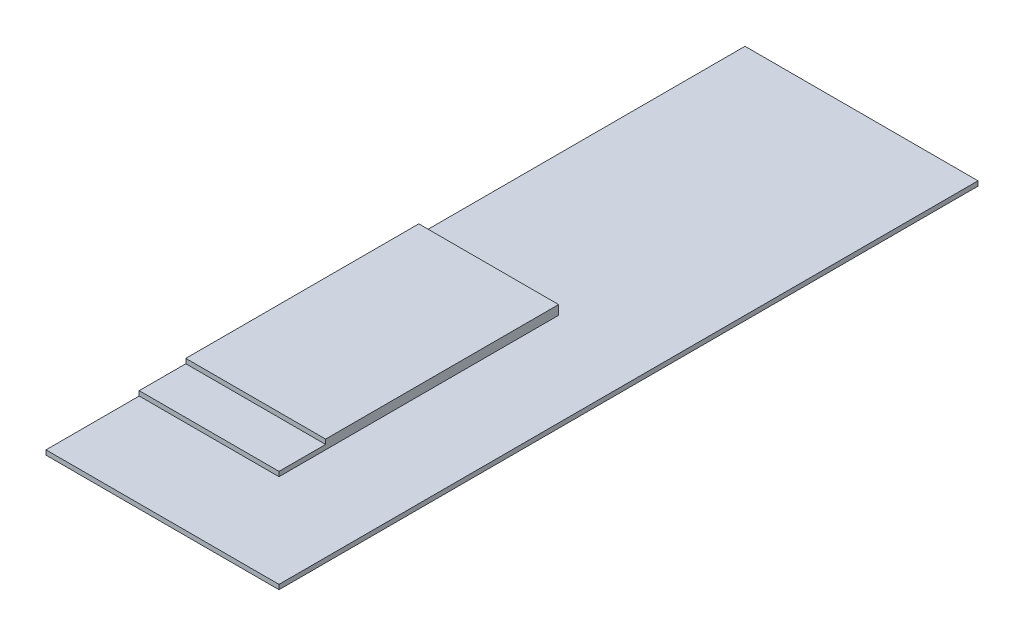
ISO-10303-21;
HEADER;
FILE_DESCRIPTION(('STEP AP214'),'2;1');
FILE_NAME('part.step','',(''),(''),'','','');
FILE_SCHEMA(('AUTOMOTIVE_DESIGN { 1 0 10303 214 1 1 1 1 }'));
ENDSEC;
DATA;
#1=APPLICATION_CONTEXT('core data for automotive mechanical design processes');
#2=APPLICATION_PROTOCOL_DEFINITION('international standard','automotive_design',2000,#1);
#3=PRODUCT_CONTEXT('',#1,'mechanical');
#4=PRODUCT('Part','Part','',(#3));
#5=PRODUCT_RELATED_PRODUCT_CATEGORY('part','',(#4));
#6=PRODUCT_DEFINITION_FORMATION('','',#4);
#7=PRODUCT_DEFINITION_CONTEXT('part definition',#1,'design');
#8=PRODUCT_DEFINITION('design','',#6,#7);
#9=PRODUCT_DEFINITION_SHAPE('','',#8);
#10=(LENGTH_UNIT() NAMED_UNIT(*) SI_UNIT(.MILLI.,.METRE.));
#11=(NAMED_UNIT(*) PLANE_ANGLE_UNIT() SI_UNIT($,.RADIAN.));
#12=(NAMED_UNIT(*) SI_UNIT($,.STERADIAN.) SOLID_ANGLE_UNIT());
#13=UNCERTAINTY_MEASURE_WITH_UNIT(LENGTH_MEASURE(1.E-05),#10,'distance_accuracy_value','');
#14=(GEOMETRIC_REPRESENTATION_CONTEXT(3) GLOBAL_UNCERTAINTY_ASSIGNED_CONTEXT((#13)) GLOBAL_UNIT_ASSIGNED_CONTEXT((#10,
#11,#12)) REPRESENTATION_CONTEXT('',''));
#15=CARTESIAN_POINT('',(0.,0.,0.));
#16=DIRECTION('',(0.,0.,1.));
#17=DIRECTION('',(1.,0.,0.));
#18=AXIS2_PLACEMENT_3D('',#15,#16,#17);
#19=CARTESIAN_POINT('',(436.363636363636,100.,-2218.18181818182));
#20=DIRECTION('',(-1.,0.,0.));
#21=DIRECTION('',(0.,0.,1.));
#22=AXIS2_PLACEMENT_3D('',#19,#20,#21);
#23=PLANE('',#22);
#24=DIRECTION('',(0.,0.,1.));
#25=VECTOR('',#24,1.);
#26=CARTESIAN_POINT('',(436.363636363636,100.,-2218.18181818182));
#27=LINE('',#26,#25);
#28=CARTESIAN_POINT('',(436.363636363636,100.,-2218.18181818182));
#29=VERTEX_POINT('',#28);
#30=CARTESIAN_POINT('',(436.363636363637,100.,3781.81818181818));
#31=VERTEX_POINT('',#30);
#32=EDGE_CURVE('E147',#29,#31,#27,.T.);
#33=ORIENTED_EDGE('',*,*,#32,.F.);
#34=DIRECTION('',(0.,-1.,0.));
#35=VECTOR('',#34,1.);
#36=CARTESIAN_POINT('',(436.363636363636,100.,-2218.18181818182));
#37=LINE('',#36,#35);
#38=CARTESIAN_POINT('',(436.363636363637,300.,-2218.18181818182));
#39=VERTEX_POINT('',#38);
#40=EDGE_CURVE('E41',#39,#29,#37,.T.);
#41=ORIENTED_EDGE('',*,*,#40,.F.);
#42=DIRECTION('',(0.,0.,-1.));
#43=VECTOR('',#42,1.);
#44=CARTESIAN_POINT('',(436.363636363637,300.,-2218.18181818182));
#45=LINE('',#44,#43);
#46=CARTESIAN_POINT('',(436.363636363637,300.,2781.81818181818));
#47=VERTEX_POINT('',#46);
#48=EDGE_CURVE('E156',#47,#39,#45,.T.);
#49=ORIENTED_EDGE('',*,*,#48,.F.);
#50=DIRECTION('',(0.,-1.,0.));
#51=VECTOR('',#50,1.);
#52=CARTESIAN_POINT('',(436.363636363637,300.,2781.81818181818));
#53=LINE('',#52,#51);
#54=CARTESIAN_POINT('',(436.363636363637,200.,2781.81818181818));
#55=VERTEX_POINT('',#54);
#56=EDGE_CURVE('E162',#47,#55,#53,.T.);
#57=ORIENTED_EDGE('',*,*,#56,.T.);
#58=DIRECTION('',(0.,0.,-1.));
#59=VECTOR('',#58,1.);
#60=CARTESIAN_POINT('',(436.363636363637,200.,3781.81818181818));
#61=LINE('',#60,#59);
#62=CARTESIAN_POINT('',(436.363636363637,200.,3781.81818181818));
#63=VERTEX_POINT('',#62);
#64=EDGE_CURVE('E174',#63,#55,#61,.T.);
#65=ORIENTED_EDGE('',*,*,#64,.F.);
#66=DIRECTION('',(0.,-1.,0.));
#67=VECTOR('',#66,1.);
#68=CARTESIAN_POINT('',(436.363636363637,200.,3781.81818181818));
#69=LINE('',#68,#67);
#70=EDGE_CURVE('E176',#63,#31,#69,.T.);
#71=ORIENTED_EDGE('',*,*,#70,.T.);
#72=EDGE_LOOP('',(#33,#41,#49,#57,#65,#71));
#73=FACE_BOUND('',#72,.T.);
#74=ADVANCED_FACE('F33',(#73),#23,.F.);
#75=CARTESIAN_POINT('',(-2563.63636363636,100.,-2218.18181818182));
#76=DIRECTION('',(0.,0.,1.));
#77=DIRECTION('',(1.,0.,0.));
#78=AXIS2_PLACEMENT_3D('',#75,#76,#77);
#79=PLANE('',#78);
#80=DIRECTION('',(1.,0.,0.));
#81=VECTOR('',#80,1.);
#82=CARTESIAN_POINT('',(-2563.63636363636,100.,-2218.18181818182));
#83=LINE('',#82,#81);
#84=CARTESIAN_POINT('',(-2563.63636363636,100.,-2218.18181818182));
#85=VERTEX_POINT('',#84);
#86=EDGE_CURVE('E48',#85,#29,#83,.T.);
#87=ORIENTED_EDGE('',*,*,#86,.F.);
#88=DIRECTION('',(0.,-1.,0.));
#89=VECTOR('',#88,1.);
#90=CARTESIAN_POINT('',(-2563.63636363636,100.,-2218.18181818182));
#91=LINE('',#90,#89);
#92=CARTESIAN_POINT('',(-2563.63636363636,300.,-2218.18181818182));
#93=VERTEX_POINT('',#92);
#94=EDGE_CURVE('E186',#93,#85,#91,.T.);
#95=ORIENTED_EDGE('',*,*,#94,.F.);
#96=DIRECTION('',(-1.,0.,0.));
#97=VECTOR('',#96,1.);
#98=CARTESIAN_POINT('',(-2563.63636363636,300.,-2218.18181818182));
#99=LINE('',#98,#97);
#100=EDGE_CURVE('E159',#39,#93,#99,.T.);
#101=ORIENTED_EDGE('',*,*,#100,.F.);
#102=ORIENTED_EDGE('',*,*,#40,.T.);
#103=EDGE_LOOP('',(#87,#95,#101,#102));
#104=FACE_BOUND('',#103,.T.);
#105=ADVANCED_FACE('F190',(#104),#79,.F.);
#106=CARTESIAN_POINT('',(0.,200.,0.));
#107=DIRECTION('',(0.,-1.,0.));
#108=DIRECTION('',(0.,0.,-1.));
#109=AXIS2_PLACEMENT_3D('',#106,#107,#108);
#110=PLANE('',#109);
#111=DIRECTION('',(1.,0.,0.));
#112=VECTOR('',#111,1.);
#113=CARTESIAN_POINT('',(-2563.63636363636,200.,2781.81818181818));
#114=LINE('',#113,#112);
#115=CARTESIAN_POINT('',(-2563.63636363636,200.,2781.81818181818));
#116=VERTEX_POINT('',#115);
#117=EDGE_CURVE('E56',#116,#55,#114,.T.);
#118=ORIENTED_EDGE('',*,*,#117,.F.);
#119=DIRECTION('',(0.,0.,1.));
#120=VECTOR('',#119,1.);
#121=CARTESIAN_POINT('',(-2563.63636363636,200.,3781.81818181818));
#122=LINE('',#121,#120);
#123=CARTESIAN_POINT('',(-2563.63636363636,200.,3781.81818181818));
#124=VERTEX_POINT('',#123);
#125=EDGE_CURVE('E170',#116,#124,#122,.T.);
#126=ORIENTED_EDGE('',*,*,#125,.T.);
#127=DIRECTION('',(1.,0.,0.));
#128=VECTOR('',#127,1.);
#129=CARTESIAN_POINT('',(-2563.63636363636,200.,3781.81818181818));
#130=LINE('',#129,#128);
#131=EDGE_CURVE('E172',#124,#63,#130,.T.);
#132=ORIENTED_EDGE('',*,*,#131,.T.);
#133=ORIENTED_EDGE('',*,*,#64,.T.);
#134=EDGE_LOOP('',(#118,#126,#132,#133));
#135=FACE_BOUND('',#134,.T.);
#136=ADVANCED_FACE('F211',(#135),#110,.F.);
#137=CARTESIAN_POINT('',(-2563.63636363636,100.,-2218.18181818182));
#138=DIRECTION('',(1.,0.,0.));
#139=DIRECTION('',(0.,0.,-1.));
#140=AXIS2_PLACEMENT_3D('',#137,#138,#139);
#141=PLANE('',#140);
#142=DIRECTION('',(0.,0.,1.));
#143=VECTOR('',#142,1.);
#144=CARTESIAN_POINT('',(-2563.63636363636,100.,-2218.18181818182));
#145=LINE('',#144,#143);
#146=CARTESIAN_POINT('',(-2563.63636363636,100.,3781.81818181818));
#147=VERTEX_POINT('',#146);
#148=CARTESIAN_POINT('',(-2563.63636363636,100.,5781.81818181818));
#149=VERTEX_POINT('',#148);
#150=EDGE_CURVE('E119',#147,#149,#145,.T.);
#151=ORIENTED_EDGE('',*,*,#150,.F.);
#152=DIRECTION('',(0.,-1.,0.));
#153=VECTOR('',#152,1.);
#154=CARTESIAN_POINT('',(-2563.63636363636,200.,3781.81818181818));
#155=LINE('',#154,#153);
#156=EDGE_CURVE('E180',#124,#147,#155,.T.);
#157=ORIENTED_EDGE('',*,*,#156,.F.);
#158=ORIENTED_EDGE('',*,*,#125,.F.);
#159=DIRECTION('',(0.,-1.,0.));
#160=VECTOR('',#159,1.);
#161=CARTESIAN_POINT('',(-2563.63636363636,300.,2781.81818181818));
#162=LINE('',#161,#160);
#163=CARTESIAN_POINT('',(-2563.63636363636,300.,2781.81818181818));
#164=VERTEX_POINT('',#163);
#165=EDGE_CURVE('E166',#164,#116,#162,.T.);
#166=ORIENTED_EDGE('',*,*,#165,.F.);
#167=DIRECTION('',(0.,0.,1.));
#168=VECTOR('',#167,1.);
#169=CARTESIAN_POINT('',(-2563.63636363636,300.,-2218.18181818182));
#170=LINE('',#169,#168);
#171=EDGE_CURVE('E151',#93,#164,#170,.T.);
#172=ORIENTED_EDGE('',*,*,#171,.F.);
#173=ORIENTED_EDGE('',*,*,#94,.T.);
#174=DIRECTION('',(0.,0.,1.));
#175=VECTOR('',#174,1.);
#176=CARTESIAN_POINT('',(-2563.63636363636,100.,5781.81818181818));
#177=LINE('',#176,#175);
#178=CARTESIAN_POINT('',(-2563.63636363636,100.,-9218.18181818182));
#179=VERTEX_POINT('',#178);
#180=EDGE_CURVE('E140',#179,#85,#177,.T.);
#181=ORIENTED_EDGE('',*,*,#180,.F.);
#182=DIRECTION('',(0.,1.,0.));
#183=VECTOR('',#182,1.);
#184=CARTESIAN_POINT('',(-2563.63636363636,0.,-9218.18181818182));
#185=LINE('',#184,#183);
#186=CARTESIAN_POINT('',(-2563.63636363636,0.,-9218.18181818182));
#187=VERTEX_POINT('',#186);
#188=EDGE_CURVE('E144',#187,#179,#185,.T.);
#189=ORIENTED_EDGE('',*,*,#188,.F.);
#190=DIRECTION('',(0.,0.,1.));
#191=VECTOR('',#190,1.);
#192=CARTESIAN_POINT('',(-2563.63636363636,0.,-2218.18181818182));
#193=LINE('',#192,#191);
#194=CARTESIAN_POINT('',(-2563.63636363636,0.,5781.81818181818));
#195=VERTEX_POINT('',#194);
#196=EDGE_CURVE('E120',#187,#195,#193,.T.);
#197=ORIENTED_EDGE('',*,*,#196,.T.);
#198=DIRECTION('',(0.,-1.,0.));
#199=VECTOR('',#198,1.);
#200=CARTESIAN_POINT('',(-2563.63636363636,100.,5781.81818181818));
#201=LINE('',#200,#199);
#202=EDGE_CURVE('E11',#149,#195,#201,.T.);
#203=ORIENTED_EDGE('',*,*,#202,.F.);
#204=EDGE_LOOP('',(#151,#157,#158,#166,#172,#173,#181,#189,#197,#203));
#205=FACE_BOUND('',#204,.T.);
#206=ADVANCED_FACE('F35',(#205),#141,.F.);
#207=CARTESIAN_POINT('',(-2563.63636363636,100.,5781.81818181818));
#208=DIRECTION('',(0.,0.,-1.));
#209=DIRECTION('',(-1.,0.,0.));
#210=AXIS2_PLACEMENT_3D('',#207,#208,#209);
#211=PLANE('',#210);
#212=DIRECTION('',(1.,0.,0.));
#213=VECTOR('',#212,1.);
#214=CARTESIAN_POINT('',(-2563.63636363636,0.,5781.81818181818));
#215=LINE('',#214,#213);
#216=CARTESIAN_POINT('',(2436.36363636364,0.,5781.81818181818));
#217=VERTEX_POINT('',#216);
#218=EDGE_CURVE('E109',#195,#217,#215,.T.);
#219=ORIENTED_EDGE('',*,*,#218,.T.);
#220=DIRECTION('',(0.,1.,0.));
#221=VECTOR('',#220,1.);
#222=CARTESIAN_POINT('',(2436.36363636364,0.,5781.81818181818));
#223=LINE('',#222,#221);
#224=CARTESIAN_POINT('',(2436.36363636364,100.,5781.81818181818));
#225=VERTEX_POINT('',#224);
#226=EDGE_CURVE('E113',#217,#225,#223,.T.);
#227=ORIENTED_EDGE('',*,*,#226,.T.);
#228=DIRECTION('',(1.,0.,0.));
#229=VECTOR('',#228,1.);
#230=CARTESIAN_POINT('',(-2563.63636363636,100.,5781.81818181818));
#231=LINE('',#230,#229);
#232=EDGE_CURVE('E184',#149,#225,#231,.T.);
#233=ORIENTED_EDGE('',*,*,#232,.F.);
#234=ORIENTED_EDGE('',*,*,#202,.T.);
#235=EDGE_LOOP('',(#219,#227,#233,#234));
#236=FACE_BOUND('',#235,.T.);
#237=ADVANCED_FACE('F111',(#236),#211,.F.);
#238=CARTESIAN_POINT('',(0.,100.,0.));
#239=DIRECTION('',(0.,1.,0.));
#240=DIRECTION('',(0.,0.,1.));
#241=AXIS2_PLACEMENT_3D('',#238,#239,#240);
#242=PLANE('',#241);
#243=DIRECTION('',(1.,0.,0.));
#244=VECTOR('',#243,1.);
#245=CARTESIAN_POINT('',(-2563.63636363636,100.,3781.81818181818));
#246=LINE('',#245,#244);
#247=EDGE_CURVE('E169',#147,#31,#246,.T.);
#248=ORIENTED_EDGE('',*,*,#247,.F.);
#249=ORIENTED_EDGE('',*,*,#150,.T.);
#250=ORIENTED_EDGE('',*,*,#232,.T.);
#251=DIRECTION('',(0.,0.,-1.));
#252=VECTOR('',#251,1.);
#253=CARTESIAN_POINT('',(2436.36363636364,100.,5781.81818181818));
#254=LINE('',#253,#252);
#255=CARTESIAN_POINT('',(2436.36363636364,100.,-9218.18181818182));
#256=VERTEX_POINT('',#255);
#257=EDGE_CURVE('E128',#225,#256,#254,.T.);
#258=ORIENTED_EDGE('',*,*,#257,.T.);
#259=DIRECTION('',(-1.,0.,0.));
#260=VECTOR('',#259,1.);
#261=CARTESIAN_POINT('',(-2563.63636363636,100.,-9218.18181818182));
#262=LINE('',#261,#260);
#263=EDGE_CURVE('E134',#256,#179,#262,.T.);
#264=ORIENTED_EDGE('',*,*,#263,.T.);
#265=ORIENTED_EDGE('',*,*,#180,.T.);
#266=ORIENTED_EDGE('',*,*,#86,.T.);
#267=ORIENTED_EDGE('',*,*,#32,.T.);
#268=EDGE_LOOP('',(#248,#249,#250,#258,#264,#265,#266,#267));
#269=FACE_BOUND('',#268,.T.);
#270=ADVANCED_FACE('F196',(#269),#242,.T.);
#271=CARTESIAN_POINT('',(0.,0.,0.));
#272=DIRECTION('',(0.,1.,0.));
#273=DIRECTION('',(0.,0.,1.));
#274=AXIS2_PLACEMENT_3D('',#271,#272,#273);
#275=PLANE('',#274);
#276=ORIENTED_EDGE('',*,*,#196,.F.);
#277=DIRECTION('',(-1.,0.,0.));
#278=VECTOR('',#277,1.);
#279=CARTESIAN_POINT('',(-2563.63636363636,0.,-9218.18181818182));
#280=LINE('',#279,#278);
#281=CARTESIAN_POINT('',(2436.36363636364,0.,-9218.18181818182));
#282=VERTEX_POINT('',#281);
#283=EDGE_CURVE('E130',#282,#187,#280,.T.);
#284=ORIENTED_EDGE('',*,*,#283,.F.);
#285=DIRECTION('',(0.,0.,-1.));
#286=VECTOR('',#285,1.);
#287=CARTESIAN_POINT('',(2436.36363636364,0.,5781.81818181818));
#288=LINE('',#287,#286);
#289=EDGE_CURVE('E125',#217,#282,#288,.T.);
#290=ORIENTED_EDGE('',*,*,#289,.F.);
#291=ORIENTED_EDGE('',*,*,#218,.F.);
#292=EDGE_LOOP('',(#276,#284,#290,#291));
#293=FACE_BOUND('',#292,.T.);
#294=ADVANCED_FACE('F132',(#293),#275,.F.);
#295=CARTESIAN_POINT('',(-2563.63636363636,200.,3781.81818181818));
#296=DIRECTION('',(0.,0.,-1.));
#297=DIRECTION('',(-1.,0.,0.));
#298=AXIS2_PLACEMENT_3D('',#295,#296,#297);
#299=PLANE('',#298);
#300=ORIENTED_EDGE('',*,*,#247,.T.);
#301=ORIENTED_EDGE('',*,*,#70,.F.);
#302=ORIENTED_EDGE('',*,*,#131,.F.);
#303=ORIENTED_EDGE('',*,*,#156,.T.);
#304=EDGE_LOOP('',(#300,#301,#302,#303));
#305=FACE_BOUND('',#304,.T.);
#306=ADVANCED_FACE('F213',(#305),#299,.F.);
#307=CARTESIAN_POINT('',(-2563.63636363636,300.,2781.81818181818));
#308=DIRECTION('',(0.,0.,-1.));
#309=DIRECTION('',(-1.,0.,0.));
#310=AXIS2_PLACEMENT_3D('',#307,#308,#309);
#311=PLANE('',#310);
#312=ORIENTED_EDGE('',*,*,#117,.T.);
#313=ORIENTED_EDGE('',*,*,#56,.F.);
#314=DIRECTION('',(1.,0.,0.));
#315=VECTOR('',#314,1.);
#316=CARTESIAN_POINT('',(-2563.63636363636,300.,2781.81818181818));
#317=LINE('',#316,#315);
#318=EDGE_CURVE('E154',#164,#47,#317,.T.);
#319=ORIENTED_EDGE('',*,*,#318,.F.);
#320=ORIENTED_EDGE('',*,*,#165,.T.);
#321=EDGE_LOOP('',(#312,#313,#319,#320));
#322=FACE_BOUND('',#321,.T.);
#323=ADVANCED_FACE('F208',(#322),#311,.F.);
#324=CARTESIAN_POINT('',(0.,300.,0.));
#325=DIRECTION('',(0.,1.,0.));
#326=DIRECTION('',(0.,0.,1.));
#327=AXIS2_PLACEMENT_3D('',#324,#325,#326);
#328=PLANE('',#327);
#329=ORIENTED_EDGE('',*,*,#171,.T.);
#330=ORIENTED_EDGE('',*,*,#318,.T.);
#331=ORIENTED_EDGE('',*,*,#48,.T.);
#332=ORIENTED_EDGE('',*,*,#100,.T.);
#333=EDGE_LOOP('',(#329,#330,#331,#332));
#334=FACE_BOUND('',#333,.T.);
#335=ADVANCED_FACE('F205',(#334),#328,.T.);
#336=CARTESIAN_POINT('',(-2563.63636363636,0.,-9218.18181818182));
#337=DIRECTION('',(0.,0.,-1.));
#338=DIRECTION('',(-1.,0.,0.));
#339=AXIS2_PLACEMENT_3D('',#336,#337,#338);
#340=PLANE('',#339);
#341=ORIENTED_EDGE('',*,*,#263,.F.);
#342=DIRECTION('',(0.,1.,0.));
#343=VECTOR('',#342,1.);
#344=CARTESIAN_POINT('',(2436.36363636364,0.,-9218.18181818182));
#345=LINE('',#344,#343);
#346=EDGE_CURVE('E129',#282,#256,#345,.T.);
#347=ORIENTED_EDGE('',*,*,#346,.F.);
#348=ORIENTED_EDGE('',*,*,#283,.T.);
#349=ORIENTED_EDGE('',*,*,#188,.T.);
#350=EDGE_LOOP('',(#341,#347,#348,#349));
#351=FACE_BOUND('',#350,.T.);
#352=ADVANCED_FACE('F215',(#351),#340,.T.);
#353=CARTESIAN_POINT('',(2436.36363636364,0.,5781.81818181818));
#354=DIRECTION('',(1.,0.,0.));
#355=DIRECTION('',(0.,0.,-1.));
#356=AXIS2_PLACEMENT_3D('',#353,#354,#355);
#357=PLANE('',#356);
#358=ORIENTED_EDGE('',*,*,#257,.F.);
#359=ORIENTED_EDGE('',*,*,#226,.F.);
#360=ORIENTED_EDGE('',*,*,#289,.T.);
#361=ORIENTED_EDGE('',*,*,#346,.T.);
#362=EDGE_LOOP('',(#358,#359,#360,#361));
#363=FACE_BOUND('',#362,.T.);
#364=ADVANCED_FACE('F124',(#363),#357,.T.);
#365=CLOSED_SHELL('',(#74,#105,#136,#206,#237,#270,#294,#306,#323,#335,#352,#364));
#366=MANIFOLD_SOLID_BREP('B2',#365);
#367=ADVANCED_BREP_SHAPE_REPRESENTATION('',(#18,#366),#14);
#368=SHAPE_DEFINITION_REPRESENTATION(#9,#367);
ENDSEC;
END-ISO-10303-21;
